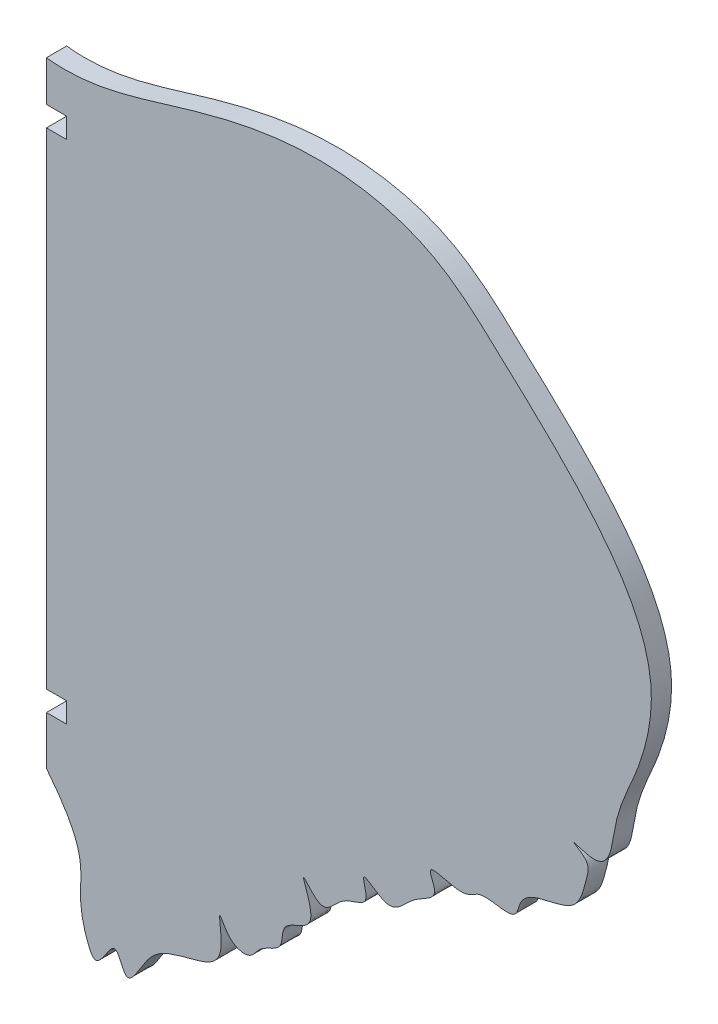
ISO-10303-21;
HEADER;
FILE_DESCRIPTION(('STEP AP214'),'2;1');
FILE_NAME('part.step','',(''),(''),'','','');
FILE_SCHEMA(('AUTOMOTIVE_DESIGN { 1 0 10303 214 1 1 1 1 }'));
ENDSEC;
DATA;
#1=APPLICATION_CONTEXT('core data for automotive mechanical design processes');
#2=APPLICATION_PROTOCOL_DEFINITION('international standard','automotive_design',2000,#1);
#3=PRODUCT_CONTEXT('',#1,'mechanical');
#4=PRODUCT('Part','Part','',(#3));
#5=PRODUCT_RELATED_PRODUCT_CATEGORY('part','',(#4));
#6=PRODUCT_DEFINITION_FORMATION('','',#4);
#7=PRODUCT_DEFINITION_CONTEXT('part definition',#1,'design');
#8=PRODUCT_DEFINITION('design','',#6,#7);
#9=PRODUCT_DEFINITION_SHAPE('','',#8);
#10=(LENGTH_UNIT() NAMED_UNIT(*) SI_UNIT(.MILLI.,.METRE.));
#11=(NAMED_UNIT(*) PLANE_ANGLE_UNIT() SI_UNIT($,.RADIAN.));
#12=(NAMED_UNIT(*) SI_UNIT($,.STERADIAN.) SOLID_ANGLE_UNIT());
#13=UNCERTAINTY_MEASURE_WITH_UNIT(LENGTH_MEASURE(1.E-05),#10,'distance_accuracy_value','');
#14=(GEOMETRIC_REPRESENTATION_CONTEXT(3) GLOBAL_UNCERTAINTY_ASSIGNED_CONTEXT((#13)) GLOBAL_UNIT_ASSIGNED_CONTEXT((#10,
#11,#12)) REPRESENTATION_CONTEXT('',''));
#15=CARTESIAN_POINT('',(0.,0.,0.));
#16=DIRECTION('',(0.,0.,1.));
#17=DIRECTION('',(1.,0.,0.));
#18=AXIS2_PLACEMENT_3D('',#15,#16,#17);
#19=CARTESIAN_POINT('',(197.433799180766,283.8523043685,3.73351138664692));
#20=DIRECTION('',(1.,0.,0.));
#21=DIRECTION('',(0.,0.,-1.));
#22=AXIS2_PLACEMENT_3D('',#19,#20,#21);
#23=PLANE('',#22);
#24=DIRECTION('',(0.,0.,1.));
#25=VECTOR('',#24,1.);
#26=CARTESIAN_POINT('',(197.433799180766,370.805825616239,3.73351138664692));
#27=LINE('',#26,#25);
#28=CARTESIAN_POINT('',(197.433799180766,370.805825616239,0.558511387004828));
#29=VERTEX_POINT('',#28);
#30=CARTESIAN_POINT('',(197.433799180766,370.805825616239,3.73351138664692));
#31=VERTEX_POINT('',#30);
#32=EDGE_CURVE('E138',#29,#31,#27,.T.);
#33=ORIENTED_EDGE('',*,*,#32,.F.);
#34=DIRECTION('',(0.,-1.,0.));
#35=VECTOR('',#34,1.);
#36=CARTESIAN_POINT('',(197.433799180766,283.8523043685,0.558511387004828));
#37=LINE('',#36,#35);
#38=CARTESIAN_POINT('',(197.433799180766,294.605825616239,0.558511387004828));
#39=VERTEX_POINT('',#38);
#40=EDGE_CURVE('E192',#29,#39,#37,.T.);
#41=ORIENTED_EDGE('',*,*,#40,.T.);
#42=DIRECTION('',(0.,0.,1.));
#43=VECTOR('',#42,1.);
#44=CARTESIAN_POINT('',(197.433799180766,294.605825616239,3.73351138664692));
#45=LINE('',#44,#43);
#46=CARTESIAN_POINT('',(197.433799180766,294.605825616239,3.73351138664692));
#47=VERTEX_POINT('',#46);
#48=EDGE_CURVE('E163',#39,#47,#45,.T.);
#49=ORIENTED_EDGE('',*,*,#48,.T.);
#50=DIRECTION('',(0.,-1.,0.));
#51=VECTOR('',#50,1.);
#52=CARTESIAN_POINT('',(197.433799180766,283.8523043685,3.73351138664692));
#53=LINE('',#52,#51);
#54=EDGE_CURVE('E181',#31,#47,#53,.T.);
#55=ORIENTED_EDGE('',*,*,#54,.F.);
#56=EDGE_LOOP('',(#33,#41,#49,#55));
#57=FACE_BOUND('',#56,.T.);
#58=ADVANCED_FACE('F46',(#57),#23,.F.);
#59=DIRECTION('',(0.,0.,1.));
#60=VECTOR('',#59,1.);
#61=CARTESIAN_POINT('',(197.433799180766,291.430825616239,3.73351138664692));
#62=LINE('',#61,#60);
#63=CARTESIAN_POINT('',(197.433799180766,291.430825616239,0.558511387004828));
#64=VERTEX_POINT('',#63);
#65=CARTESIAN_POINT('',(197.433799180766,291.430825616239,3.73351138664692));
#66=VERTEX_POINT('',#65);
#67=EDGE_CURVE('E159',#64,#66,#62,.T.);
#68=ORIENTED_EDGE('',*,*,#67,.F.);
#69=CARTESIAN_POINT('',(197.433799180766,283.8523043685,0.558511387004828));
#70=VERTEX_POINT('',#69);
#71=EDGE_CURVE('E186',#64,#70,#37,.T.);
#72=ORIENTED_EDGE('',*,*,#71,.T.);
#73=DIRECTION('',(0.,0.,-1.));
#74=VECTOR('',#73,1.);
#75=CARTESIAN_POINT('',(197.433799180766,283.8523043685,3.73351138664692));
#76=LINE('',#75,#74);
#77=CARTESIAN_POINT('',(197.433799180766,283.8523043685,3.73351138664692));
#78=VERTEX_POINT('',#77);
#79=EDGE_CURVE('E180',#78,#70,#76,.T.);
#80=ORIENTED_EDGE('',*,*,#79,.F.);
#81=EDGE_CURVE('E174',#66,#78,#53,.T.);
#82=ORIENTED_EDGE('',*,*,#81,.F.);
#83=EDGE_LOOP('',(#68,#72,#80,#82));
#84=FACE_BOUND('',#83,.T.);
#85=ADVANCED_FACE('F227',(#84),#23,.F.);
#86=CARTESIAN_POINT('',(197.433799180766,283.8523043685,3.73351138664692));
#87=CARTESIAN_POINT('',(206.32360769478,272.69844024939,3.73351138664692));
#88=CARTESIAN_POINT('',(200.158638035687,271.934212437034,3.73351138664692));
#89=CARTESIAN_POINT('',(205.435848239213,259.817139467603,3.73351138664692));
#90=CARTESIAN_POINT('',(208.212232882642,267.270560017764,3.73351138664692));
#91=CARTESIAN_POINT('',(210.027417062333,259.366068978047,3.73351138664692));
#92=CARTESIAN_POINT('',(213.271729403374,267.126896759848,3.73351138664692));
#93=CARTESIAN_POINT('',(216.912330505298,268.448662813997,3.73351138664692));
#94=CARTESIAN_POINT('',(221.15150740584,269.656080211751,3.73351138664692));
#95=CARTESIAN_POINT('',(226.069865740368,270.821745493914,3.73351138664692));
#96=CARTESIAN_POINT('',(223.815752549613,279.684453007152,3.73351138664692));
#97=CARTESIAN_POINT('',(226.115207597942,274.471020084821,3.73351138664692));
#98=CARTESIAN_POINT('',(229.488485261967,273.772552599464,3.73351138664692));
#99=CARTESIAN_POINT('',(231.029553248889,276.791462359941,3.73351138664692));
#100=CARTESIAN_POINT('',(234.697417747053,277.329586497987,3.73351138664692));
#101=CARTESIAN_POINT('',(234.024184460368,282.221323788124,3.73351138664692));
#102=CARTESIAN_POINT('',(241.216652910245,282.160705320982,3.73351138664692));
#103=CARTESIAN_POINT('',(236.012752740026,291.940358175988,3.73351138664692));
#104=CARTESIAN_POINT('',(241.038854862149,284.924740749554,3.73351138664692));
#105=CARTESIAN_POINT('',(243.461558580901,290.042827794395,3.73351138664692));
#106=CARTESIAN_POINT('',(248.585192768678,289.974699526758,3.73351138664692));
#107=CARTESIAN_POINT('',(246.12955712089,295.650462225521,3.73351138664692));
#108=CARTESIAN_POINT('',(251.784103008451,290.203172838653,3.73351138664692));
#109=CARTESIAN_POINT('',(254.239781776192,295.244663947414,3.73351138664692));
#110=CARTESIAN_POINT('',(259.366839111956,296.629384323551,3.73351138664692));
#111=CARTESIAN_POINT('',(256.111898124406,301.871299753124,3.73351138664692));
#112=CARTESIAN_POINT('',(262.63956515186,298.490411636609,3.73351138664692));
#113=CARTESIAN_POINT('',(265.871513582717,301.834073983877,3.73351138664692));
#114=CARTESIAN_POINT('',(271.000919343548,299.200361930515,3.73351138664692));
#115=CARTESIAN_POINT('',(272.060450512448,305.722354673334,3.73351138664692));
#116=CARTESIAN_POINT('',(280.663246548642,304.355333539486,3.73351138664692));
#117=CARTESIAN_POINT('',(281.832087677198,310.382314379474,3.73351138664692));
#118=CARTESIAN_POINT('',(282.775693555074,313.688575075346,3.73351138664692));
#119=CARTESIAN_POINT('',(278.486190419711,315.88705582991,3.73351138664692));
#120=CARTESIAN_POINT('',(285.810372026128,312.858145640835,3.73351138664692));
#121=CARTESIAN_POINT('',(286.273599015024,322.393025249777,3.73351138664692));
#122=CARTESIAN_POINT('',(290.529373942576,329.807683180417,3.73351138664692));
#123=CARTESIAN_POINT('',(294.626695226783,346.693645916845,3.73351138664692));
#124=CARTESIAN_POINT('',(282.443320992371,362.597772202969,3.73351138664692));
#125=CARTESIAN_POINT('',(269.504566183364,374.520755206342,3.73351138664692));
#126=CARTESIAN_POINT('',(256.792135374851,386.388555397527,3.73351138664692));
#127=CARTESIAN_POINT('',(237.201974500094,389.207309194803,3.73351138664692));
#128=CARTESIAN_POINT('',(217.164313960102,383.900356412744,3.73351138664692));
#129=CARTESIAN_POINT('',(204.270515846373,379.529111604362,3.73351138664692));
#130=CARTESIAN_POINT('',(197.433799180766,380.330825616239,3.73351138664692));
#131=B_SPLINE_CURVE_WITH_KNOTS('',3,(#86,#87,#88,#89,#90,#91,#92,#93,#94,#95,#96,#97,#98,#99,
#100,#101,#102,#103,#104,#105,#106,#107,#108,#109,#110,#111,#112,#113,#114,#115,#116,#117,#118,
#119,#120,#121,#122,#123,#124,#125,#126,#127,#128,#129,#130),.UNSPECIFIED.,.F.,.F.,(4,1,1,1,1,1,
1,1,1,1,1,1,1,1,1,1,1,1,1,1,1,1,1,1,1,1,1,1,1,1,1,1,1,1,1,1,1,1,1,1,1,1,4),(0.,
0.0721797834709226,0.0804388683801533,0.0950165266897409,0.105821538912415,0.122848078638267,
0.141910152310671,0.150248273326071,0.168357514955517,0.185537450029733,0.195389942668072,
0.205949354347415,0.214048053408297,0.226436680772143,0.23588130569911,0.253061240773326,
0.27170584616838,0.283880860494529,0.298814123702137,0.312170840365379,0.32140477800987,
0.334209945568197,0.35267782085718,0.366469408394092,0.374807529409492,0.393168550135494,
0.401891115968741,0.421395366110099,0.427563151560134,0.459324097535386,0.47676922920188,
0.483641203231567,0.492586508721266,0.503145920400609,0.525735339339673,0.559788418791376,
0.602917318092619,0.68902290588549,0.743290233062117,0.787292336530612,0.863213050824874,
0.931049022711092,1.),.UNSPECIFIED.);
#132=DIRECTION('',(0.,0.,-1.));
#133=VECTOR('',#132,1.);
#134=SURFACE_OF_LINEAR_EXTRUSION('',#131,#133);
#135=CARTESIAN_POINT('',(197.433799180766,283.8523043685,0.558511387004828));
#136=CARTESIAN_POINT('',(206.32360769478,272.69844024939,0.558511387004828));
#137=CARTESIAN_POINT('',(200.158638035687,271.934212437034,0.558511387004828));
#138=CARTESIAN_POINT('',(205.435848239213,259.817139467603,0.558511387004828));
#139=CARTESIAN_POINT('',(208.212232882642,267.270560017764,0.558511387004828));
#140=CARTESIAN_POINT('',(210.027417062333,259.366068978047,0.558511387004828));
#141=CARTESIAN_POINT('',(213.271729403374,267.126896759848,0.558511387004828));
#142=CARTESIAN_POINT('',(216.912330505298,268.448662813997,0.558511387004828));
#143=CARTESIAN_POINT('',(221.15150740584,269.656080211751,0.558511387004828));
#144=CARTESIAN_POINT('',(226.069865740368,270.821745493914,0.558511387004828));
#145=CARTESIAN_POINT('',(223.815752549613,279.684453007152,0.558511387004828));
#146=CARTESIAN_POINT('',(226.115207597942,274.471020084821,0.558511387004828));
#147=CARTESIAN_POINT('',(229.488485261967,273.772552599464,0.558511387004828));
#148=CARTESIAN_POINT('',(231.029553248889,276.791462359941,0.558511387004828));
#149=CARTESIAN_POINT('',(234.697417747053,277.329586497987,0.558511387004828));
#150=CARTESIAN_POINT('',(234.024184460368,282.221323788124,0.558511387004828));
#151=CARTESIAN_POINT('',(241.216652910245,282.160705320982,0.558511387004828));
#152=CARTESIAN_POINT('',(236.012752740026,291.940358175988,0.558511387004828));
#153=CARTESIAN_POINT('',(241.038854862149,284.924740749554,0.558511387004828));
#154=CARTESIAN_POINT('',(243.461558580901,290.042827794395,0.558511387004828));
#155=CARTESIAN_POINT('',(248.585192768678,289.974699526758,0.558511387004828));
#156=CARTESIAN_POINT('',(246.12955712089,295.650462225521,0.558511387004828));
#157=CARTESIAN_POINT('',(251.784103008451,290.203172838653,0.558511387004828));
#158=CARTESIAN_POINT('',(254.239781776192,295.244663947414,0.558511387004828));
#159=CARTESIAN_POINT('',(259.366839111956,296.629384323551,0.558511387004828));
#160=CARTESIAN_POINT('',(256.111898124406,301.871299753124,0.558511387004828));
#161=CARTESIAN_POINT('',(262.63956515186,298.490411636609,0.558511387004828));
#162=CARTESIAN_POINT('',(265.871513582717,301.834073983877,0.558511387004828));
#163=CARTESIAN_POINT('',(271.000919343548,299.200361930515,0.558511387004828));
#164=CARTESIAN_POINT('',(272.060450512448,305.722354673334,0.558511387004828));
#165=CARTESIAN_POINT('',(280.663246548642,304.355333539486,0.558511387004828));
#166=CARTESIAN_POINT('',(281.832087677198,310.382314379474,0.558511387004828));
#167=CARTESIAN_POINT('',(282.775693555074,313.688575075346,0.558511387004828));
#168=CARTESIAN_POINT('',(278.486190419711,315.88705582991,0.558511387004828));
#169=CARTESIAN_POINT('',(285.810372026128,312.858145640835,0.558511387004828));
#170=CARTESIAN_POINT('',(286.273599015024,322.393025249777,0.558511387004828));
#171=CARTESIAN_POINT('',(290.529373942576,329.807683180417,0.558511387004828));
#172=CARTESIAN_POINT('',(294.626695226783,346.693645916845,0.558511387004828));
#173=CARTESIAN_POINT('',(282.443320992371,362.597772202969,0.558511387004828));
#174=CARTESIAN_POINT('',(269.504566183364,374.520755206342,0.558511387004828));
#175=CARTESIAN_POINT('',(256.792135374851,386.388555397527,0.558511387004828));
#176=CARTESIAN_POINT('',(237.201974500094,389.207309194803,0.558511387004828));
#177=CARTESIAN_POINT('',(217.164313960102,383.900356412744,0.558511387004828));
#178=CARTESIAN_POINT('',(204.270515846373,379.529111604362,0.558511387004828));
#179=CARTESIAN_POINT('',(197.433799180766,380.330825616239,0.558511387004828));
#180=B_SPLINE_CURVE_WITH_KNOTS('',3,(#135,#136,#137,#138,#139,#140,#141,#142,#143,#144,#145,
#146,#147,#148,#149,#150,#151,#152,#153,#154,#155,#156,#157,#158,#159,#160,#161,#162,#163,#164,
#165,#166,#167,#168,#169,#170,#171,#172,#173,#174,#175,#176,#177,#178,#179),.UNSPECIFIED.,.F.,
.F.,(4,1,1,1,1,1,1,1,1,1,1,1,1,1,1,1,1,1,1,1,1,1,1,1,1,1,1,1,1,1,1,1,1,1,1,1,1,1,1,1,1,1,4),(0.,
0.0721797834709226,0.0804388683801533,0.0950165266897409,0.105821538912415,0.122848078638267,
0.141910152310671,0.150248273326071,0.168357514955517,0.185537450029733,0.195389942668072,
0.205949354347415,0.214048053408297,0.226436680772143,0.23588130569911,0.253061240773326,
0.27170584616838,0.283880860494529,0.298814123702137,0.312170840365379,0.32140477800987,
0.334209945568197,0.35267782085718,0.366469408394092,0.374807529409492,0.393168550135494,
0.401891115968741,0.421395366110099,0.427563151560134,0.459324097535386,0.47676922920188,
0.483641203231567,0.492586508721266,0.503145920400609,0.525735339339673,0.559788418791376,
0.602917318092619,0.68902290588549,0.743290233062117,0.787292336530612,0.863213050824874,
0.931049022711092,1.),.UNSPECIFIED.);
#181=CARTESIAN_POINT('',(197.433799180766,380.330825616239,0.558511387004828));
#182=VERTEX_POINT('',#181);
#183=EDGE_CURVE('E168',#70,#182,#180,.T.);
#184=ORIENTED_EDGE('',*,*,#183,.T.);
#185=DIRECTION('',(0.,0.,-1.));
#186=VECTOR('',#185,1.);
#187=CARTESIAN_POINT('',(197.433799180766,380.330825616239,3.73351138664692));
#188=LINE('',#187,#186);
#189=CARTESIAN_POINT('',(197.433799180766,380.330825616239,3.73351138664692));
#190=VERTEX_POINT('',#189);
#191=EDGE_CURVE('E195',#190,#182,#188,.T.);
#192=ORIENTED_EDGE('',*,*,#191,.F.);
#193=EDGE_CURVE('E169',#78,#190,#131,.T.);
#194=ORIENTED_EDGE('',*,*,#193,.F.);
#195=ORIENTED_EDGE('',*,*,#79,.T.);
#196=EDGE_LOOP('',(#184,#192,#194,#195));
#197=FACE_BOUND('',#196,.T.);
#198=ADVANCED_FACE('F48',(#197),#134,.F.);
#199=CARTESIAN_POINT('',(197.433799180766,373.980825616239,0.558511387004828));
#200=VERTEX_POINT('',#199);
#201=EDGE_CURVE('E175',#182,#200,#37,.T.);
#202=ORIENTED_EDGE('',*,*,#201,.T.);
#203=DIRECTION('',(0.,0.,1.));
#204=VECTOR('',#203,1.);
#205=CARTESIAN_POINT('',(197.433799180766,373.980825616239,3.73351138664692));
#206=LINE('',#205,#204);
#207=CARTESIAN_POINT('',(197.433799180766,373.980825616239,3.73351138664692));
#208=VERTEX_POINT('',#207);
#209=EDGE_CURVE('E144',#200,#208,#206,.T.);
#210=ORIENTED_EDGE('',*,*,#209,.T.);
#211=EDGE_CURVE('E143',#190,#208,#53,.T.);
#212=ORIENTED_EDGE('',*,*,#211,.F.);
#213=ORIENTED_EDGE('',*,*,#191,.T.);
#214=EDGE_LOOP('',(#202,#210,#212,#213));
#215=FACE_BOUND('',#214,.T.);
#216=ADVANCED_FACE('F234',(#215),#23,.F.);
#217=CARTESIAN_POINT('',(281.931457649921,314.628308794037,3.73351138664692));
#218=DIRECTION('',(0.,0.,-1.));
#219=DIRECTION('',(-1.,0.,0.));
#220=AXIS2_PLACEMENT_3D('',#217,#218,#219);
#221=PLANE('',#220);
#222=ORIENTED_EDGE('',*,*,#211,.T.);
#223=DIRECTION('',(1.,0.,0.));
#224=VECTOR('',#223,1.);
#225=CARTESIAN_POINT('',(281.931457649921,373.980825616239,3.73351138664692));
#226=LINE('',#225,#224);
#227=CARTESIAN_POINT('',(200.608799180767,373.980825616239,3.7335113866471));
#228=VERTEX_POINT('',#227);
#229=EDGE_CURVE('E126',#208,#228,#226,.T.);
#230=ORIENTED_EDGE('',*,*,#229,.T.);
#231=DIRECTION('',(0.,-1.,0.));
#232=VECTOR('',#231,1.);
#233=CARTESIAN_POINT('',(200.608799180767,373.980825616239,3.7335113866471));
#234=LINE('',#233,#232);
#235=CARTESIAN_POINT('',(200.608799180767,370.805825616239,3.7335113866471));
#236=VERTEX_POINT('',#235);
#237=EDGE_CURVE('E134',#228,#236,#234,.T.);
#238=ORIENTED_EDGE('',*,*,#237,.T.);
#239=DIRECTION('',(1.,0.,0.));
#240=VECTOR('',#239,1.);
#241=CARTESIAN_POINT('',(281.931457649921,370.805825616239,3.73351138664692));
#242=LINE('',#241,#240);
#243=EDGE_CURVE('E148',#31,#236,#242,.T.);
#244=ORIENTED_EDGE('',*,*,#243,.F.);
#245=ORIENTED_EDGE('',*,*,#54,.T.);
#246=DIRECTION('',(1.,0.,0.));
#247=VECTOR('',#246,1.);
#248=CARTESIAN_POINT('',(281.931457649921,294.605825616239,3.73351138664692));
#249=LINE('',#248,#247);
#250=CARTESIAN_POINT('',(200.608799180767,294.605825616239,3.7335113866471));
#251=VERTEX_POINT('',#250);
#252=EDGE_CURVE('E166',#47,#251,#249,.T.);
#253=ORIENTED_EDGE('',*,*,#252,.T.);
#254=DIRECTION('',(0.,-1.,0.));
#255=VECTOR('',#254,1.);
#256=CARTESIAN_POINT('',(200.608799180767,294.605825616239,3.7335113866471));
#257=LINE('',#256,#255);
#258=CARTESIAN_POINT('',(200.608799180767,291.430825616239,3.7335113866471));
#259=VERTEX_POINT('',#258);
#260=EDGE_CURVE('E156',#251,#259,#257,.T.);
#261=ORIENTED_EDGE('',*,*,#260,.T.);
#262=DIRECTION('',(1.,0.,0.));
#263=VECTOR('',#262,1.);
#264=CARTESIAN_POINT('',(281.931457649921,291.430825616239,3.73351138664692));
#265=LINE('',#264,#263);
#266=EDGE_CURVE('E161',#66,#259,#265,.T.);
#267=ORIENTED_EDGE('',*,*,#266,.F.);
#268=ORIENTED_EDGE('',*,*,#81,.T.);
#269=ORIENTED_EDGE('',*,*,#193,.T.);
#270=EDGE_LOOP('',(#222,#230,#238,#244,#245,#253,#261,#267,#268,#269));
#271=FACE_BOUND('',#270,.T.);
#272=ADVANCED_FACE('F141',(#271),#221,.F.);
#273=CARTESIAN_POINT('',(281.931457649921,314.628308794037,0.558511387004828));
#274=DIRECTION('',(0.,0.,-1.));
#275=DIRECTION('',(-1.,0.,0.));
#276=AXIS2_PLACEMENT_3D('',#273,#274,#275);
#277=PLANE('',#276);
#278=DIRECTION('',(1.,0.,0.));
#279=VECTOR('',#278,1.);
#280=CARTESIAN_POINT('',(281.931457649921,373.980825616239,0.558511387004828));
#281=LINE('',#280,#279);
#282=CARTESIAN_POINT('',(200.608799180767,373.980825616239,0.558511386647087));
#283=VERTEX_POINT('',#282);
#284=EDGE_CURVE('E13',#200,#283,#281,.T.);
#285=ORIENTED_EDGE('',*,*,#284,.F.);
#286=ORIENTED_EDGE('',*,*,#201,.F.);
#287=ORIENTED_EDGE('',*,*,#183,.F.);
#288=ORIENTED_EDGE('',*,*,#71,.F.);
#289=DIRECTION('',(1.,0.,0.));
#290=VECTOR('',#289,1.);
#291=CARTESIAN_POINT('',(281.931457649921,291.430825616239,0.558511387004828));
#292=LINE('',#291,#290);
#293=CARTESIAN_POINT('',(200.608799180767,291.430825616239,0.558511387004828));
#294=VERTEX_POINT('',#293);
#295=EDGE_CURVE('E198',#64,#294,#292,.T.);
#296=ORIENTED_EDGE('',*,*,#295,.T.);
#297=DIRECTION('',(0.,-1.,0.));
#298=VECTOR('',#297,1.);
#299=CARTESIAN_POINT('',(200.608799180767,294.605825616239,0.558511386647087));
#300=LINE('',#299,#298);
#301=CARTESIAN_POINT('',(200.608799180767,294.605825616239,0.558511386647087));
#302=VERTEX_POINT('',#301);
#303=EDGE_CURVE('E153',#302,#294,#300,.T.);
#304=ORIENTED_EDGE('',*,*,#303,.F.);
#305=DIRECTION('',(1.,0.,0.));
#306=VECTOR('',#305,1.);
#307=CARTESIAN_POINT('',(281.931457649921,294.605825616239,0.558511387004828));
#308=LINE('',#307,#306);
#309=EDGE_CURVE('E201',#39,#302,#308,.T.);
#310=ORIENTED_EDGE('',*,*,#309,.F.);
#311=ORIENTED_EDGE('',*,*,#40,.F.);
#312=DIRECTION('',(1.,0.,0.));
#313=VECTOR('',#312,1.);
#314=CARTESIAN_POINT('',(281.931457649921,370.805825616239,0.558511387004828));
#315=LINE('',#314,#313);
#316=CARTESIAN_POINT('',(200.608799180767,370.805825616239,0.558511387004828));
#317=VERTEX_POINT('',#316);
#318=EDGE_CURVE('E55',#29,#317,#315,.T.);
#319=ORIENTED_EDGE('',*,*,#318,.T.);
#320=DIRECTION('',(0.,-1.,0.));
#321=VECTOR('',#320,1.);
#322=CARTESIAN_POINT('',(200.608799180767,373.980825616239,0.558511386647087));
#323=LINE('',#322,#321);
#324=EDGE_CURVE('E131',#283,#317,#323,.T.);
#325=ORIENTED_EDGE('',*,*,#324,.F.);
#326=EDGE_LOOP('',(#285,#286,#287,#288,#296,#304,#310,#311,#319,#325));
#327=FACE_BOUND('',#326,.T.);
#328=ADVANCED_FACE('F205',(#327),#277,.T.);
#329=CARTESIAN_POINT('',(186.321299180767,294.605825616239,181.362329514992));
#330=DIRECTION('',(0.,1.,0.));
#331=DIRECTION('',(0.,0.,-1.));
#332=AXIS2_PLACEMENT_3D('',#329,#330,#331);
#333=PLANE('',#332);
#334=ORIENTED_EDGE('',*,*,#48,.F.);
#335=ORIENTED_EDGE('',*,*,#309,.T.);
#336=DIRECTION('',(0.,0.,-1.));
#337=VECTOR('',#336,1.);
#338=CARTESIAN_POINT('',(200.608799180767,294.605825616239,181.362329514992));
#339=LINE('',#338,#337);
#340=EDGE_CURVE('E146',#251,#302,#339,.T.);
#341=ORIENTED_EDGE('',*,*,#340,.F.);
#342=ORIENTED_EDGE('',*,*,#252,.F.);
#343=EDGE_LOOP('',(#334,#335,#341,#342));
#344=FACE_BOUND('',#343,.T.);
#345=ADVANCED_FACE('F217',(#344),#333,.F.);
#346=CARTESIAN_POINT('',(186.321299180767,291.430825616239,181.362329514992));
#347=DIRECTION('',(0.,1.,0.));
#348=DIRECTION('',(0.,0.,-1.));
#349=AXIS2_PLACEMENT_3D('',#346,#347,#348);
#350=PLANE('',#349);
#351=ORIENTED_EDGE('',*,*,#266,.T.);
#352=DIRECTION('',(0.,0.,-1.));
#353=VECTOR('',#352,1.);
#354=CARTESIAN_POINT('',(200.608799180767,291.430825616239,181.362329514992));
#355=LINE('',#354,#353);
#356=EDGE_CURVE('E70',#259,#294,#355,.T.);
#357=ORIENTED_EDGE('',*,*,#356,.T.);
#358=ORIENTED_EDGE('',*,*,#295,.F.);
#359=ORIENTED_EDGE('',*,*,#67,.T.);
#360=EDGE_LOOP('',(#351,#357,#358,#359));
#361=FACE_BOUND('',#360,.T.);
#362=ADVANCED_FACE('F235',(#361),#350,.T.);
#363=CARTESIAN_POINT('',(200.608799180767,294.605825616239,181.362329514992));
#364=DIRECTION('',(-1.,0.,0.));
#365=DIRECTION('',(0.,1.,0.));
#366=AXIS2_PLACEMENT_3D('',#363,#364,#365);
#367=PLANE('',#366);
#368=ORIENTED_EDGE('',*,*,#356,.F.);
#369=ORIENTED_EDGE('',*,*,#260,.F.);
#370=ORIENTED_EDGE('',*,*,#340,.T.);
#371=ORIENTED_EDGE('',*,*,#303,.T.);
#372=EDGE_LOOP('',(#368,#369,#370,#371));
#373=FACE_BOUND('',#372,.T.);
#374=ADVANCED_FACE('F221',(#373),#367,.T.);
#375=CARTESIAN_POINT('',(186.321299180767,373.980825616239,181.362329514992));
#376=DIRECTION('',(0.,1.,0.));
#377=DIRECTION('',(0.,0.,-1.));
#378=AXIS2_PLACEMENT_3D('',#375,#376,#377);
#379=PLANE('',#378);
#380=ORIENTED_EDGE('',*,*,#209,.F.);
#381=ORIENTED_EDGE('',*,*,#284,.T.);
#382=DIRECTION('',(0.,0.,-1.));
#383=VECTOR('',#382,1.);
#384=CARTESIAN_POINT('',(200.608799180767,373.980825616239,181.362329514992));
#385=LINE('',#384,#383);
#386=EDGE_CURVE('E122',#228,#283,#385,.T.);
#387=ORIENTED_EDGE('',*,*,#386,.F.);
#388=ORIENTED_EDGE('',*,*,#229,.F.);
#389=EDGE_LOOP('',(#380,#381,#387,#388));
#390=FACE_BOUND('',#389,.T.);
#391=ADVANCED_FACE('F124',(#390),#379,.F.);
#392=CARTESIAN_POINT('',(186.321299180767,370.805825616239,181.362329514992));
#393=DIRECTION('',(0.,1.,0.));
#394=DIRECTION('',(0.,0.,-1.));
#395=AXIS2_PLACEMENT_3D('',#392,#393,#394);
#396=PLANE('',#395);
#397=ORIENTED_EDGE('',*,*,#243,.T.);
#398=DIRECTION('',(0.,0.,-1.));
#399=VECTOR('',#398,1.);
#400=CARTESIAN_POINT('',(200.608799180767,370.805825616239,181.362329514992));
#401=LINE('',#400,#399);
#402=EDGE_CURVE('E62',#236,#317,#401,.T.);
#403=ORIENTED_EDGE('',*,*,#402,.T.);
#404=ORIENTED_EDGE('',*,*,#318,.F.);
#405=ORIENTED_EDGE('',*,*,#32,.T.);
#406=EDGE_LOOP('',(#397,#403,#404,#405));
#407=FACE_BOUND('',#406,.T.);
#408=ADVANCED_FACE('F208',(#407),#396,.T.);
#409=CARTESIAN_POINT('',(200.608799180767,373.980825616239,181.362329514992));
#410=DIRECTION('',(-1.,0.,0.));
#411=DIRECTION('',(0.,1.,0.));
#412=AXIS2_PLACEMENT_3D('',#409,#410,#411);
#413=PLANE('',#412);
#414=ORIENTED_EDGE('',*,*,#402,.F.);
#415=ORIENTED_EDGE('',*,*,#237,.F.);
#416=ORIENTED_EDGE('',*,*,#386,.T.);
#417=ORIENTED_EDGE('',*,*,#324,.T.);
#418=EDGE_LOOP('',(#414,#415,#416,#417));
#419=FACE_BOUND('',#418,.T.);
#420=ADVANCED_FACE('F135',(#419),#413,.T.);
#421=CLOSED_SHELL('',(#58,#85,#198,#216,#272,#328,#345,#362,#374,#391,#408,#420));
#422=MANIFOLD_SOLID_BREP('B2',#421);
#423=ADVANCED_BREP_SHAPE_REPRESENTATION('',(#18,#422),#14);
#424=SHAPE_DEFINITION_REPRESENTATION(#9,#423);
ENDSEC;
END-ISO-10303-21;
